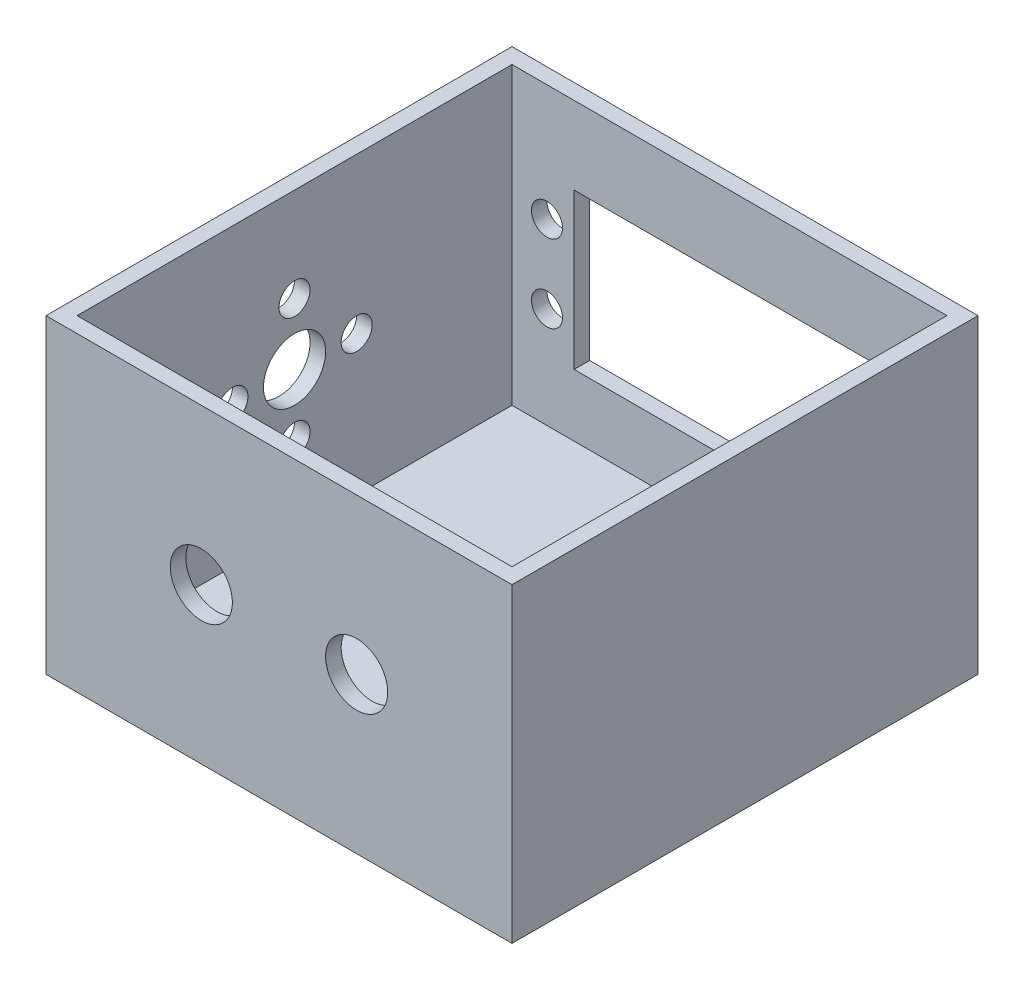
ISO-10303-21;
HEADER;
FILE_DESCRIPTION(('STEP AP214'),'2;1');
FILE_NAME('part.step','',(''),(''),'','','');
FILE_SCHEMA(('AUTOMOTIVE_DESIGN { 1 0 10303 214 1 1 1 1 }'));
ENDSEC;
DATA;
#1=APPLICATION_CONTEXT('core data for automotive mechanical design processes');
#2=APPLICATION_PROTOCOL_DEFINITION('international standard','automotive_design',2000,#1);
#3=PRODUCT_CONTEXT('',#1,'mechanical');
#4=PRODUCT('Part','Part','',(#3));
#5=PRODUCT_RELATED_PRODUCT_CATEGORY('part','',(#4));
#6=PRODUCT_DEFINITION_FORMATION('','',#4);
#7=PRODUCT_DEFINITION_CONTEXT('part definition',#1,'design');
#8=PRODUCT_DEFINITION('design','',#6,#7);
#9=PRODUCT_DEFINITION_SHAPE('','',#8);
#10=(LENGTH_UNIT() NAMED_UNIT(*) SI_UNIT(.MILLI.,.METRE.));
#11=(NAMED_UNIT(*) PLANE_ANGLE_UNIT() SI_UNIT($,.RADIAN.));
#12=(NAMED_UNIT(*) SI_UNIT($,.STERADIAN.) SOLID_ANGLE_UNIT());
#13=UNCERTAINTY_MEASURE_WITH_UNIT(LENGTH_MEASURE(1.E-05),#10,'distance_accuracy_value','');
#14=(GEOMETRIC_REPRESENTATION_CONTEXT(3) GLOBAL_UNCERTAINTY_ASSIGNED_CONTEXT((#13)) GLOBAL_UNIT_ASSIGNED_CONTEXT((#10,
#11,#12)) REPRESENTATION_CONTEXT('',''));
#15=CARTESIAN_POINT('',(0.,0.,0.));
#16=DIRECTION('',(0.,0.,1.));
#17=DIRECTION('',(1.,0.,0.));
#18=AXIS2_PLACEMENT_3D('',#15,#16,#17);
#19=CARTESIAN_POINT('',(0.,40.,60.));
#20=DIRECTION('',(0.,-1.,0.));
#21=DIRECTION('',(1.,0.,0.));
#22=AXIS2_PLACEMENT_3D('',#19,#20,#21);
#23=PLANE('',#22);
#24=DIRECTION('',(-1.,0.,0.));
#25=VECTOR('',#24,1.);
#26=CARTESIAN_POINT('',(0.,40.,0.));
#27=LINE('',#26,#25);
#28=CARTESIAN_POINT('',(60.,40.,0.));
#29=VERTEX_POINT('',#28);
#30=CARTESIAN_POINT('',(0.,40.,0.));
#31=VERTEX_POINT('',#30);
#32=EDGE_CURVE('E191',#29,#31,#27,.T.);
#33=ORIENTED_EDGE('',*,*,#32,.T.);
#34=DIRECTION('',(0.,0.,-1.));
#35=VECTOR('',#34,1.);
#36=CARTESIAN_POINT('',(0.,40.,60.));
#37=LINE('',#36,#35);
#38=CARTESIAN_POINT('',(0.,40.,60.));
#39=VERTEX_POINT('',#38);
#40=EDGE_CURVE('E197',#39,#31,#37,.T.);
#41=ORIENTED_EDGE('',*,*,#40,.F.);
#42=DIRECTION('',(-1.,0.,0.));
#43=VECTOR('',#42,1.);
#44=CARTESIAN_POINT('',(0.,40.,60.));
#45=LINE('',#44,#43);
#46=CARTESIAN_POINT('',(60.,40.,60.));
#47=VERTEX_POINT('',#46);
#48=EDGE_CURVE('E195',#47,#39,#45,.T.);
#49=ORIENTED_EDGE('',*,*,#48,.F.);
#50=DIRECTION('',(0.,0.,-1.));
#51=VECTOR('',#50,1.);
#52=CARTESIAN_POINT('',(60.,40.,60.));
#53=LINE('',#52,#51);
#54=EDGE_CURVE('E207',#47,#29,#53,.T.);
#55=ORIENTED_EDGE('',*,*,#54,.T.);
#56=EDGE_LOOP('',(#33,#41,#49,#55));
#57=FACE_BOUND('',#56,.T.);
#58=DIRECTION('',(-1.,0.,0.));
#59=VECTOR('',#58,1.);
#60=CARTESIAN_POINT('',(0.,40.,2.));
#61=LINE('',#60,#59);
#62=CARTESIAN_POINT('',(58.,40.,2.));
#63=VERTEX_POINT('',#62);
#64=CARTESIAN_POINT('',(2.,40.,2.));
#65=VERTEX_POINT('',#64);
#66=EDGE_CURVE('E167',#63,#65,#61,.T.);
#67=ORIENTED_EDGE('',*,*,#66,.F.);
#68=DIRECTION('',(0.,0.,-1.));
#69=VECTOR('',#68,1.);
#70=CARTESIAN_POINT('',(58.,40.,60.));
#71=LINE('',#70,#69);
#72=CARTESIAN_POINT('',(58.,40.,58.));
#73=VERTEX_POINT('',#72);
#74=EDGE_CURVE('E172',#73,#63,#71,.T.);
#75=ORIENTED_EDGE('',*,*,#74,.F.);
#76=DIRECTION('',(-1.,0.,0.));
#77=VECTOR('',#76,1.);
#78=CARTESIAN_POINT('',(0.,40.,58.));
#79=LINE('',#78,#77);
#80=CARTESIAN_POINT('',(2.,40.,58.));
#81=VERTEX_POINT('',#80);
#82=EDGE_CURVE('E178',#73,#81,#79,.T.);
#83=ORIENTED_EDGE('',*,*,#82,.T.);
#84=DIRECTION('',(0.,0.,-1.));
#85=VECTOR('',#84,1.);
#86=CARTESIAN_POINT('',(2.,40.,60.));
#87=LINE('',#86,#85);
#88=EDGE_CURVE('E179',#81,#65,#87,.T.);
#89=ORIENTED_EDGE('',*,*,#88,.T.);
#90=EDGE_LOOP('',(#67,#75,#83,#89));
#91=FACE_BOUND('',#90,.T.);
#92=ADVANCED_FACE('F35',(#57,#91),#23,.F.);
#93=CARTESIAN_POINT('',(0.,0.,60.));
#94=DIRECTION('',(1.,0.,0.));
#95=DIRECTION('',(0.,0.,-1.));
#96=AXIS2_PLACEMENT_3D('',#93,#94,#95);
#97=PLANE('',#96);
#98=CARTESIAN_POINT('',(0.,12.101681923366,30.));
#99=DIRECTION('',(-1.,0.,0.));
#100=DIRECTION('',(0.,0.,-1.));
#101=AXIS2_PLACEMENT_3D('',#98,#99,#100);
#102=CIRCLE('',#101,1.99999999999999);
#103=CARTESIAN_POINT('',(0.,12.101681923366,28.));
#104=VERTEX_POINT('',#103);
#105=EDGE_CURVE('E359',#104,#104,#102,.T.);
#106=ORIENTED_EDGE('',*,*,#105,.F.);
#107=EDGE_LOOP('',(#106));
#108=FACE_BOUND('',#107,.T.);
#109=CARTESIAN_POINT('',(0.,27.898318076634,30.));
#110=DIRECTION('',(-1.,0.,0.));
#111=DIRECTION('',(0.,0.,1.));
#112=AXIS2_PLACEMENT_3D('',#109,#110,#111);
#113=CIRCLE('',#112,2.);
#114=CARTESIAN_POINT('',(0.,27.898318076634,32.));
#115=VERTEX_POINT('',#114);
#116=EDGE_CURVE('E352',#115,#115,#113,.T.);
#117=ORIENTED_EDGE('',*,*,#116,.F.);
#118=EDGE_LOOP('',(#117));
#119=FACE_BOUND('',#118,.T.);
#120=CARTESIAN_POINT('',(0.,20.,38.));
#121=DIRECTION('',(-1.,0.,0.));
#122=DIRECTION('',(0.,0.,-1.));
#123=AXIS2_PLACEMENT_3D('',#120,#121,#122);
#124=CIRCLE('',#123,2.00000000000001);
#125=CARTESIAN_POINT('',(0.,20.,36.));
#126=VERTEX_POINT('',#125);
#127=EDGE_CURVE('E357',#126,#126,#124,.T.);
#128=ORIENTED_EDGE('',*,*,#127,.F.);
#129=EDGE_LOOP('',(#128));
#130=FACE_BOUND('',#129,.T.);
#131=CARTESIAN_POINT('',(0.,20.,30.));
#132=DIRECTION('',(-1.,0.,0.));
#133=DIRECTION('',(0.,0.,1.));
#134=AXIS2_PLACEMENT_3D('',#131,#132,#133);
#135=CIRCLE('',#134,4.);
#136=CARTESIAN_POINT('',(0.,20.,34.));
#137=VERTEX_POINT('',#136);
#138=EDGE_CURVE('E370',#137,#137,#135,.T.);
#139=ORIENTED_EDGE('',*,*,#138,.F.);
#140=EDGE_LOOP('',(#139));
#141=FACE_BOUND('',#140,.T.);
#142=CARTESIAN_POINT('',(0.,20.,22.));
#143=DIRECTION('',(-1.,0.,0.));
#144=DIRECTION('',(0.,0.,1.));
#145=AXIS2_PLACEMENT_3D('',#142,#143,#144);
#146=CIRCLE('',#145,2.00000000000001);
#147=CARTESIAN_POINT('',(0.,20.,24.));
#148=VERTEX_POINT('',#147);
#149=EDGE_CURVE('E378',#148,#148,#146,.T.);
#150=ORIENTED_EDGE('',*,*,#149,.F.);
#151=EDGE_LOOP('',(#150));
#152=FACE_BOUND('',#151,.T.);
#153=DIRECTION('',(0.,-1.,0.));
#154=VECTOR('',#153,1.);
#155=CARTESIAN_POINT('',(0.,0.,0.));
#156=LINE('',#155,#154);
#157=CARTESIAN_POINT('',(0.,0.,0.));
#158=VERTEX_POINT('',#157);
#159=EDGE_CURVE('E161',#31,#158,#156,.T.);
#160=ORIENTED_EDGE('',*,*,#159,.T.);
#161=DIRECTION('',(0.,0.,-1.));
#162=VECTOR('',#161,1.);
#163=CARTESIAN_POINT('',(0.,0.,60.));
#164=LINE('',#163,#162);
#165=CARTESIAN_POINT('',(0.,0.,60.));
#166=VERTEX_POINT('',#165);
#167=EDGE_CURVE('E11',#166,#158,#164,.T.);
#168=ORIENTED_EDGE('',*,*,#167,.F.);
#169=DIRECTION('',(0.,-1.,0.));
#170=VECTOR('',#169,1.);
#171=CARTESIAN_POINT('',(0.,0.,60.));
#172=LINE('',#171,#170);
#173=EDGE_CURVE('E187',#39,#166,#172,.T.);
#174=ORIENTED_EDGE('',*,*,#173,.F.);
#175=ORIENTED_EDGE('',*,*,#40,.T.);
#176=EDGE_LOOP('',(#160,#168,#174,#175));
#177=FACE_BOUND('',#176,.T.);
#178=ADVANCED_FACE('F37',(#108,#119,#130,#141,#152,#177),#97,.F.);
#179=CARTESIAN_POINT('',(0.,0.,60.));
#180=DIRECTION('',(0.,1.,0.));
#181=DIRECTION('',(0.,0.,1.));
#182=AXIS2_PLACEMENT_3D('',#179,#180,#181);
#183=PLANE('',#182);
#184=CARTESIAN_POINT('',(22.,0.,30.));
#185=DIRECTION('',(0.,-1.,0.));
#186=DIRECTION('',(0.,0.,1.));
#187=AXIS2_PLACEMENT_3D('',#184,#185,#186);
#188=CIRCLE('',#187,2.);
#189=CARTESIAN_POINT('',(22.,0.,32.));
#190=VERTEX_POINT('',#189);
#191=EDGE_CURVE('E401',#190,#190,#188,.T.);
#192=ORIENTED_EDGE('',*,*,#191,.F.);
#193=EDGE_LOOP('',(#192));
#194=FACE_BOUND('',#193,.T.);
#195=CARTESIAN_POINT('',(30.,0.,38.));
#196=DIRECTION('',(0.,-1.,0.));
#197=DIRECTION('',(0.,0.,-1.));
#198=AXIS2_PLACEMENT_3D('',#195,#196,#197);
#199=CIRCLE('',#198,2.00000000000001);
#200=CARTESIAN_POINT('',(30.,0.,36.));
#201=VERTEX_POINT('',#200);
#202=EDGE_CURVE('E394',#201,#201,#199,.T.);
#203=ORIENTED_EDGE('',*,*,#202,.F.);
#204=EDGE_LOOP('',(#203));
#205=FACE_BOUND('',#204,.T.);
#206=CARTESIAN_POINT('',(38.,0.,30.));
#207=DIRECTION('',(0.,-1.,0.));
#208=DIRECTION('',(0.,0.,-1.));
#209=AXIS2_PLACEMENT_3D('',#206,#207,#208);
#210=CIRCLE('',#209,2.);
#211=CARTESIAN_POINT('',(38.,0.,28.));
#212=VERTEX_POINT('',#211);
#213=EDGE_CURVE('E413',#212,#212,#210,.T.);
#214=ORIENTED_EDGE('',*,*,#213,.F.);
#215=EDGE_LOOP('',(#214));
#216=FACE_BOUND('',#215,.T.);
#217=CARTESIAN_POINT('',(30.,0.,22.));
#218=DIRECTION('',(0.,-1.,0.));
#219=DIRECTION('',(0.,0.,1.));
#220=AXIS2_PLACEMENT_3D('',#217,#218,#219);
#221=CIRCLE('',#220,2.00000000000001);
#222=CARTESIAN_POINT('',(30.,0.,24.));
#223=VERTEX_POINT('',#222);
#224=EDGE_CURVE('E406',#223,#223,#221,.T.);
#225=ORIENTED_EDGE('',*,*,#224,.F.);
#226=EDGE_LOOP('',(#225));
#227=FACE_BOUND('',#226,.T.);
#228=CARTESIAN_POINT('',(30.,0.,30.));
#229=DIRECTION('',(0.,-1.,0.));
#230=DIRECTION('',(0.,0.,-1.));
#231=AXIS2_PLACEMENT_3D('',#228,#229,#230);
#232=CIRCLE('',#231,2.);
#233=CARTESIAN_POINT('',(30.,0.,28.));
#234=VERTEX_POINT('',#233);
#235=EDGE_CURVE('E418',#234,#234,#232,.T.);
#236=ORIENTED_EDGE('',*,*,#235,.F.);
#237=EDGE_LOOP('',(#236));
#238=FACE_BOUND('',#237,.T.);
#239=DIRECTION('',(1.,0.,0.));
#240=VECTOR('',#239,1.);
#241=CARTESIAN_POINT('',(0.,0.,0.));
#242=LINE('',#241,#240);
#243=CARTESIAN_POINT('',(60.,0.,0.));
#244=VERTEX_POINT('',#243);
#245=EDGE_CURVE('E200',#158,#244,#242,.T.);
#246=ORIENTED_EDGE('',*,*,#245,.T.);
#247=DIRECTION('',(0.,0.,-1.));
#248=VECTOR('',#247,1.);
#249=CARTESIAN_POINT('',(60.,0.,60.));
#250=LINE('',#249,#248);
#251=CARTESIAN_POINT('',(60.,0.,60.));
#252=VERTEX_POINT('',#251);
#253=EDGE_CURVE('E43',#252,#244,#250,.T.);
#254=ORIENTED_EDGE('',*,*,#253,.F.);
#255=DIRECTION('',(1.,0.,0.));
#256=VECTOR('',#255,1.);
#257=CARTESIAN_POINT('',(0.,0.,60.));
#258=LINE('',#257,#256);
#259=EDGE_CURVE('E190',#166,#252,#258,.T.);
#260=ORIENTED_EDGE('',*,*,#259,.F.);
#261=ORIENTED_EDGE('',*,*,#167,.T.);
#262=EDGE_LOOP('',(#246,#254,#260,#261));
#263=FACE_BOUND('',#262,.T.);
#264=ADVANCED_FACE('F228',(#194,#205,#216,#227,#238,#263),#183,.F.);
#265=CARTESIAN_POINT('',(60.,0.,60.));
#266=DIRECTION('',(-1.,0.,0.));
#267=DIRECTION('',(0.,0.,1.));
#268=AXIS2_PLACEMENT_3D('',#265,#266,#267);
#269=PLANE('',#268);
#270=DIRECTION('',(0.,1.,0.));
#271=VECTOR('',#270,1.);
#272=CARTESIAN_POINT('',(60.,0.,0.));
#273=LINE('',#272,#271);
#274=EDGE_CURVE('E202',#244,#29,#273,.T.);
#275=ORIENTED_EDGE('',*,*,#274,.T.);
#276=ORIENTED_EDGE('',*,*,#54,.F.);
#277=DIRECTION('',(0.,1.,0.));
#278=VECTOR('',#277,1.);
#279=CARTESIAN_POINT('',(60.,0.,60.));
#280=LINE('',#279,#278);
#281=EDGE_CURVE('E193',#252,#47,#280,.T.);
#282=ORIENTED_EDGE('',*,*,#281,.F.);
#283=ORIENTED_EDGE('',*,*,#253,.T.);
#284=EDGE_LOOP('',(#275,#276,#282,#283));
#285=FACE_BOUND('',#284,.T.);
#286=ADVANCED_FACE('F214',(#285),#269,.F.);
#287=CARTESIAN_POINT('',(0.,0.,60.));
#288=DIRECTION('',(0.,0.,-1.));
#289=DIRECTION('',(-1.,0.,0.));
#290=AXIS2_PLACEMENT_3D('',#287,#288,#289);
#291=PLANE('',#290);
#292=CARTESIAN_POINT('',(40.,20.,60.));
#293=DIRECTION('',(0.,0.,-1.));
#294=DIRECTION('',(-1.,0.,0.));
#295=AXIS2_PLACEMENT_3D('',#292,#293,#294);
#296=CIRCLE('',#295,3.99999999999999);
#297=CARTESIAN_POINT('',(36.,20.,60.));
#298=VERTEX_POINT('',#297);
#299=EDGE_CURVE('E384',#298,#298,#296,.T.);
#300=ORIENTED_EDGE('',*,*,#299,.T.);
#301=EDGE_LOOP('',(#300));
#302=FACE_BOUND('',#301,.T.);
#303=CARTESIAN_POINT('',(20.,20.,60.));
#304=DIRECTION('',(0.,0.,1.));
#305=DIRECTION('',(1.,0.,0.));
#306=AXIS2_PLACEMENT_3D('',#303,#304,#305);
#307=CIRCLE('',#306,4.);
#308=CARTESIAN_POINT('',(24.,20.,60.));
#309=VERTEX_POINT('',#308);
#310=EDGE_CURVE('E388',#309,#309,#307,.T.);
#311=ORIENTED_EDGE('',*,*,#310,.F.);
#312=EDGE_LOOP('',(#311));
#313=FACE_BOUND('',#312,.T.);
#314=ORIENTED_EDGE('',*,*,#173,.T.);
#315=ORIENTED_EDGE('',*,*,#259,.T.);
#316=ORIENTED_EDGE('',*,*,#281,.T.);
#317=ORIENTED_EDGE('',*,*,#48,.T.);
#318=EDGE_LOOP('',(#314,#315,#316,#317));
#319=FACE_BOUND('',#318,.T.);
#320=ADVANCED_FACE('F227',(#302,#313,#319),#291,.F.);
#321=CARTESIAN_POINT('',(0.,0.,0.));
#322=DIRECTION('',(0.,0.,-1.));
#323=DIRECTION('',(-1.,0.,0.));
#324=AXIS2_PLACEMENT_3D('',#321,#322,#323);
#325=PLANE('',#324);
#326=CARTESIAN_POINT('',(53.5,25.,0.));
#327=DIRECTION('',(0.,0.,-1.));
#328=DIRECTION('',(-1.,0.,0.));
#329=AXIS2_PLACEMENT_3D('',#326,#327,#328);
#330=CIRCLE('',#329,2.);
#331=CARTESIAN_POINT('',(51.5,25.,0.));
#332=VERTEX_POINT('',#331);
#333=EDGE_CURVE('E424',#332,#332,#330,.T.);
#334=ORIENTED_EDGE('',*,*,#333,.F.);
#335=EDGE_LOOP('',(#334));
#336=FACE_BOUND('',#335,.T.);
#337=CARTESIAN_POINT('',(53.5,15.,0.));
#338=DIRECTION('',(0.,0.,-1.));
#339=DIRECTION('',(1.,0.,0.));
#340=AXIS2_PLACEMENT_3D('',#337,#338,#339);
#341=CIRCLE('',#340,2.);
#342=CARTESIAN_POINT('',(55.5,15.,0.));
#343=VERTEX_POINT('',#342);
#344=EDGE_CURVE('E432',#343,#343,#341,.T.);
#345=ORIENTED_EDGE('',*,*,#344,.F.);
#346=EDGE_LOOP('',(#345));
#347=FACE_BOUND('',#346,.T.);
#348=CARTESIAN_POINT('',(6.5,15.,0.));
#349=DIRECTION('',(0.,0.,-1.));
#350=DIRECTION('',(-1.,0.,0.));
#351=AXIS2_PLACEMENT_3D('',#348,#349,#350);
#352=CIRCLE('',#351,2.);
#353=CARTESIAN_POINT('',(4.5,15.,0.));
#354=VERTEX_POINT('',#353);
#355=EDGE_CURVE('E438',#354,#354,#352,.T.);
#356=ORIENTED_EDGE('',*,*,#355,.F.);
#357=EDGE_LOOP('',(#356));
#358=FACE_BOUND('',#357,.T.);
#359=CARTESIAN_POINT('',(6.5,25.,0.));
#360=DIRECTION('',(0.,0.,-1.));
#361=DIRECTION('',(1.,0.,0.));
#362=AXIS2_PLACEMENT_3D('',#359,#360,#361);
#363=CIRCLE('',#362,2.);
#364=CARTESIAN_POINT('',(8.5,25.,0.));
#365=VERTEX_POINT('',#364);
#366=EDGE_CURVE('E421',#365,#365,#363,.T.);
#367=ORIENTED_EDGE('',*,*,#366,.F.);
#368=EDGE_LOOP('',(#367));
#369=FACE_BOUND('',#368,.T.);
#370=DIRECTION('',(-1.,0.,0.));
#371=VECTOR('',#370,1.);
#372=CARTESIAN_POINT('',(50.,10.,0.));
#373=LINE('',#372,#371);
#374=CARTESIAN_POINT('',(50.,10.,0.));
#375=VERTEX_POINT('',#374);
#376=CARTESIAN_POINT('',(10.,10.,0.));
#377=VERTEX_POINT('',#376);
#378=EDGE_CURVE('E126',#375,#377,#373,.T.);
#379=ORIENTED_EDGE('',*,*,#378,.F.);
#380=DIRECTION('',(0.,-1.,0.));
#381=VECTOR('',#380,1.);
#382=CARTESIAN_POINT('',(50.,30.,0.));
#383=LINE('',#382,#381);
#384=CARTESIAN_POINT('',(50.,30.,0.));
#385=VERTEX_POINT('',#384);
#386=EDGE_CURVE('E134',#385,#375,#383,.T.);
#387=ORIENTED_EDGE('',*,*,#386,.F.);
#388=DIRECTION('',(1.,0.,0.));
#389=VECTOR('',#388,1.);
#390=CARTESIAN_POINT('',(50.,30.,0.));
#391=LINE('',#390,#389);
#392=CARTESIAN_POINT('',(10.,30.,0.));
#393=VERTEX_POINT('',#392);
#394=EDGE_CURVE('E50',#393,#385,#391,.T.);
#395=ORIENTED_EDGE('',*,*,#394,.F.);
#396=DIRECTION('',(0.,1.,0.));
#397=VECTOR('',#396,1.);
#398=CARTESIAN_POINT('',(10.,30.,0.));
#399=LINE('',#398,#397);
#400=EDGE_CURVE('E143',#377,#393,#399,.T.);
#401=ORIENTED_EDGE('',*,*,#400,.F.);
#402=EDGE_LOOP('',(#379,#387,#395,#401));
#403=FACE_BOUND('',#402,.T.);
#404=ORIENTED_EDGE('',*,*,#159,.F.);
#405=ORIENTED_EDGE('',*,*,#32,.F.);
#406=ORIENTED_EDGE('',*,*,#274,.F.);
#407=ORIENTED_EDGE('',*,*,#245,.F.);
#408=EDGE_LOOP('',(#404,#405,#406,#407));
#409=FACE_BOUND('',#408,.T.);
#410=ADVANCED_FACE('F140',(#336,#347,#358,#369,#403,#409),#325,.T.);
#411=CARTESIAN_POINT('',(2.,0.,60.));
#412=DIRECTION('',(1.,0.,0.));
#413=DIRECTION('',(0.,0.,-1.));
#414=AXIS2_PLACEMENT_3D('',#411,#412,#413);
#415=PLANE('',#414);
#416=CARTESIAN_POINT('',(2.,12.101681923366,30.));
#417=DIRECTION('',(1.,0.,0.));
#418=DIRECTION('',(0.,0.,-1.));
#419=AXIS2_PLACEMENT_3D('',#416,#417,#418);
#420=CIRCLE('',#419,1.99999999999999);
#421=CARTESIAN_POINT('',(2.,12.101681923366,28.));
#422=VERTEX_POINT('',#421);
#423=EDGE_CURVE('E362',#422,#422,#420,.F.);
#424=ORIENTED_EDGE('',*,*,#423,.T.);
#425=EDGE_LOOP('',(#424));
#426=FACE_BOUND('',#425,.T.);
#427=CARTESIAN_POINT('',(2.,27.898318076634,30.));
#428=DIRECTION('',(1.,0.,0.));
#429=DIRECTION('',(0.,0.,-1.));
#430=AXIS2_PLACEMENT_3D('',#427,#428,#429);
#431=CIRCLE('',#430,2.);
#432=CARTESIAN_POINT('',(2.,27.898318076634,28.));
#433=VERTEX_POINT('',#432);
#434=EDGE_CURVE('E349',#433,#433,#431,.F.);
#435=ORIENTED_EDGE('',*,*,#434,.T.);
#436=EDGE_LOOP('',(#435));
#437=FACE_BOUND('',#436,.T.);
#438=CARTESIAN_POINT('',(2.,20.,38.));
#439=DIRECTION('',(1.,0.,0.));
#440=DIRECTION('',(0.,0.,-1.));
#441=AXIS2_PLACEMENT_3D('',#438,#439,#440);
#442=CIRCLE('',#441,2.00000000000001);
#443=CARTESIAN_POINT('',(2.,20.,36.));
#444=VERTEX_POINT('',#443);
#445=EDGE_CURVE('E354',#444,#444,#442,.F.);
#446=ORIENTED_EDGE('',*,*,#445,.T.);
#447=EDGE_LOOP('',(#446));
#448=FACE_BOUND('',#447,.T.);
#449=CARTESIAN_POINT('',(2.,20.,30.));
#450=DIRECTION('',(1.,0.,0.));
#451=DIRECTION('',(0.,0.,-1.));
#452=AXIS2_PLACEMENT_3D('',#449,#450,#451);
#453=CIRCLE('',#452,4.);
#454=CARTESIAN_POINT('',(2.,20.,26.));
#455=VERTEX_POINT('',#454);
#456=EDGE_CURVE('E367',#455,#455,#453,.F.);
#457=ORIENTED_EDGE('',*,*,#456,.T.);
#458=EDGE_LOOP('',(#457));
#459=FACE_BOUND('',#458,.T.);
#460=CARTESIAN_POINT('',(2.,20.,22.));
#461=DIRECTION('',(1.,0.,0.));
#462=DIRECTION('',(0.,0.,-1.));
#463=AXIS2_PLACEMENT_3D('',#460,#461,#462);
#464=CIRCLE('',#463,2.00000000000001);
#465=CARTESIAN_POINT('',(2.,20.,20.));
#466=VERTEX_POINT('',#465);
#467=EDGE_CURVE('E372',#466,#466,#464,.F.);
#468=ORIENTED_EDGE('',*,*,#467,.T.);
#469=EDGE_LOOP('',(#468));
#470=FACE_BOUND('',#469,.T.);
#471=DIRECTION('',(0.,-1.,0.));
#472=VECTOR('',#471,1.);
#473=CARTESIAN_POINT('',(2.,0.,2.));
#474=LINE('',#473,#472);
#475=CARTESIAN_POINT('',(2.,2.,2.));
#476=VERTEX_POINT('',#475);
#477=EDGE_CURVE('E154',#65,#476,#474,.T.);
#478=ORIENTED_EDGE('',*,*,#477,.F.);
#479=ORIENTED_EDGE('',*,*,#88,.F.);
#480=DIRECTION('',(0.,-1.,0.));
#481=VECTOR('',#480,1.);
#482=CARTESIAN_POINT('',(2.,0.,58.));
#483=LINE('',#482,#481);
#484=CARTESIAN_POINT('',(2.,2.,58.));
#485=VERTEX_POINT('',#484);
#486=EDGE_CURVE('E163',#81,#485,#483,.T.);
#487=ORIENTED_EDGE('',*,*,#486,.T.);
#488=DIRECTION('',(0.,0.,-1.));
#489=VECTOR('',#488,1.);
#490=CARTESIAN_POINT('',(2.,2.,60.));
#491=LINE('',#490,#489);
#492=EDGE_CURVE('E158',#485,#476,#491,.T.);
#493=ORIENTED_EDGE('',*,*,#492,.T.);
#494=EDGE_LOOP('',(#478,#479,#487,#493));
#495=FACE_BOUND('',#494,.T.);
#496=ADVANCED_FACE('F246',(#426,#437,#448,#459,#470,#495),#415,.T.);
#497=CARTESIAN_POINT('',(0.,2.,60.));
#498=DIRECTION('',(0.,1.,0.));
#499=DIRECTION('',(0.,0.,1.));
#500=AXIS2_PLACEMENT_3D('',#497,#498,#499);
#501=PLANE('',#500);
#502=CARTESIAN_POINT('',(22.,2.,30.));
#503=DIRECTION('',(0.,1.,0.));
#504=DIRECTION('',(0.,0.,1.));
#505=AXIS2_PLACEMENT_3D('',#502,#503,#504);
#506=CIRCLE('',#505,2.);
#507=CARTESIAN_POINT('',(22.,2.,32.));
#508=VERTEX_POINT('',#507);
#509=EDGE_CURVE('E391',#508,#508,#506,.F.);
#510=ORIENTED_EDGE('',*,*,#509,.T.);
#511=EDGE_LOOP('',(#510));
#512=FACE_BOUND('',#511,.T.);
#513=CARTESIAN_POINT('',(30.,2.,38.));
#514=DIRECTION('',(0.,1.,0.));
#515=DIRECTION('',(0.,0.,1.));
#516=AXIS2_PLACEMENT_3D('',#513,#514,#515);
#517=CIRCLE('',#516,2.00000000000001);
#518=CARTESIAN_POINT('',(30.,2.,40.));
#519=VERTEX_POINT('',#518);
#520=EDGE_CURVE('E398',#519,#519,#517,.F.);
#521=ORIENTED_EDGE('',*,*,#520,.T.);
#522=EDGE_LOOP('',(#521));
#523=FACE_BOUND('',#522,.T.);
#524=CARTESIAN_POINT('',(38.,2.,30.));
#525=DIRECTION('',(0.,1.,0.));
#526=DIRECTION('',(0.,0.,1.));
#527=AXIS2_PLACEMENT_3D('',#524,#525,#526);
#528=CIRCLE('',#527,2.);
#529=CARTESIAN_POINT('',(38.,2.,32.));
#530=VERTEX_POINT('',#529);
#531=EDGE_CURVE('E397',#530,#530,#528,.F.);
#532=ORIENTED_EDGE('',*,*,#531,.T.);
#533=EDGE_LOOP('',(#532));
#534=FACE_BOUND('',#533,.T.);
#535=CARTESIAN_POINT('',(30.,2.,22.));
#536=DIRECTION('',(0.,1.,0.));
#537=DIRECTION('',(0.,0.,1.));
#538=AXIS2_PLACEMENT_3D('',#535,#536,#537);
#539=CIRCLE('',#538,2.00000000000001);
#540=CARTESIAN_POINT('',(30.,2.,24.));
#541=VERTEX_POINT('',#540);
#542=EDGE_CURVE('E410',#541,#541,#539,.F.);
#543=ORIENTED_EDGE('',*,*,#542,.T.);
#544=EDGE_LOOP('',(#543));
#545=FACE_BOUND('',#544,.T.);
#546=CARTESIAN_POINT('',(30.,2.,30.));
#547=DIRECTION('',(0.,1.,0.));
#548=DIRECTION('',(0.,0.,1.));
#549=AXIS2_PLACEMENT_3D('',#546,#547,#548);
#550=CIRCLE('',#549,2.);
#551=CARTESIAN_POINT('',(30.,2.,32.));
#552=VERTEX_POINT('',#551);
#553=EDGE_CURVE('E409',#552,#552,#550,.F.);
#554=ORIENTED_EDGE('',*,*,#553,.T.);
#555=EDGE_LOOP('',(#554));
#556=FACE_BOUND('',#555,.T.);
#557=DIRECTION('',(1.,0.,0.));
#558=VECTOR('',#557,1.);
#559=CARTESIAN_POINT('',(0.,2.,2.));
#560=LINE('',#559,#558);
#561=CARTESIAN_POINT('',(58.,2.,2.));
#562=VERTEX_POINT('',#561);
#563=EDGE_CURVE('E157',#476,#562,#560,.T.);
#564=ORIENTED_EDGE('',*,*,#563,.F.);
#565=ORIENTED_EDGE('',*,*,#492,.F.);
#566=DIRECTION('',(1.,0.,0.));
#567=VECTOR('',#566,1.);
#568=CARTESIAN_POINT('',(0.,2.,58.));
#569=LINE('',#568,#567);
#570=CARTESIAN_POINT('',(58.,2.,58.));
#571=VERTEX_POINT('',#570);
#572=EDGE_CURVE('E166',#485,#571,#569,.T.);
#573=ORIENTED_EDGE('',*,*,#572,.T.);
#574=DIRECTION('',(0.,0.,-1.));
#575=VECTOR('',#574,1.);
#576=CARTESIAN_POINT('',(58.,2.,60.));
#577=LINE('',#576,#575);
#578=EDGE_CURVE('E162',#571,#562,#577,.T.);
#579=ORIENTED_EDGE('',*,*,#578,.T.);
#580=EDGE_LOOP('',(#564,#565,#573,#579));
#581=FACE_BOUND('',#580,.T.);
#582=ADVANCED_FACE('F262',(#512,#523,#534,#545,#556,#581),#501,.T.);
#583=CARTESIAN_POINT('',(58.,0.,60.));
#584=DIRECTION('',(-1.,0.,0.));
#585=DIRECTION('',(0.,0.,1.));
#586=AXIS2_PLACEMENT_3D('',#583,#584,#585);
#587=PLANE('',#586);
#588=DIRECTION('',(0.,1.,0.));
#589=VECTOR('',#588,1.);
#590=CARTESIAN_POINT('',(58.,0.,2.));
#591=LINE('',#590,#589);
#592=EDGE_CURVE('E169',#562,#63,#591,.T.);
#593=ORIENTED_EDGE('',*,*,#592,.F.);
#594=ORIENTED_EDGE('',*,*,#578,.F.);
#595=DIRECTION('',(0.,1.,0.));
#596=VECTOR('',#595,1.);
#597=CARTESIAN_POINT('',(58.,0.,58.));
#598=LINE('',#597,#596);
#599=EDGE_CURVE('E174',#571,#73,#598,.T.);
#600=ORIENTED_EDGE('',*,*,#599,.T.);
#601=ORIENTED_EDGE('',*,*,#74,.T.);
#602=EDGE_LOOP('',(#593,#594,#600,#601));
#603=FACE_BOUND('',#602,.T.);
#604=ADVANCED_FACE('F258',(#603),#587,.T.);
#605=CARTESIAN_POINT('',(0.,0.,58.));
#606=DIRECTION('',(0.,0.,-1.));
#607=DIRECTION('',(-1.,0.,0.));
#608=AXIS2_PLACEMENT_3D('',#605,#606,#607);
#609=PLANE('',#608);
#610=CARTESIAN_POINT('',(40.,20.,58.));
#611=DIRECTION('',(0.,0.,-1.));
#612=DIRECTION('',(-1.,0.,0.));
#613=AXIS2_PLACEMENT_3D('',#610,#611,#612);
#614=CIRCLE('',#613,3.99999999999999);
#615=CARTESIAN_POINT('',(36.,20.,58.));
#616=VERTEX_POINT('',#615);
#617=EDGE_CURVE('E381',#616,#616,#614,.T.);
#618=ORIENTED_EDGE('',*,*,#617,.F.);
#619=EDGE_LOOP('',(#618));
#620=FACE_BOUND('',#619,.T.);
#621=CARTESIAN_POINT('',(20.,20.,58.));
#622=DIRECTION('',(0.,0.,-1.));
#623=DIRECTION('',(-1.,0.,0.));
#624=AXIS2_PLACEMENT_3D('',#621,#622,#623);
#625=CIRCLE('',#624,4.);
#626=CARTESIAN_POINT('',(16.,20.,58.));
#627=VERTEX_POINT('',#626);
#628=EDGE_CURVE('E387',#627,#627,#625,.F.);
#629=ORIENTED_EDGE('',*,*,#628,.T.);
#630=EDGE_LOOP('',(#629));
#631=FACE_BOUND('',#630,.T.);
#632=ORIENTED_EDGE('',*,*,#486,.F.);
#633=ORIENTED_EDGE('',*,*,#82,.F.);
#634=ORIENTED_EDGE('',*,*,#599,.F.);
#635=ORIENTED_EDGE('',*,*,#572,.F.);
#636=EDGE_LOOP('',(#632,#633,#634,#635));
#637=FACE_BOUND('',#636,.T.);
#638=ADVANCED_FACE('F254',(#620,#631,#637),#609,.T.);
#639=CARTESIAN_POINT('',(0.,0.,2.));
#640=DIRECTION('',(0.,0.,-1.));
#641=DIRECTION('',(-1.,0.,0.));
#642=AXIS2_PLACEMENT_3D('',#639,#640,#641);
#643=PLANE('',#642);
#644=CARTESIAN_POINT('',(53.5,25.,2.));
#645=DIRECTION('',(0.,0.,-1.));
#646=DIRECTION('',(-1.,0.,0.));
#647=AXIS2_PLACEMENT_3D('',#644,#645,#646);
#648=CIRCLE('',#647,2.);
#649=CARTESIAN_POINT('',(51.5,25.,2.));
#650=VERTEX_POINT('',#649);
#651=EDGE_CURVE('E427',#650,#650,#648,.F.);
#652=ORIENTED_EDGE('',*,*,#651,.F.);
#653=EDGE_LOOP('',(#652));
#654=FACE_BOUND('',#653,.T.);
#655=CARTESIAN_POINT('',(53.5,15.,2.));
#656=DIRECTION('',(0.,0.,-1.));
#657=DIRECTION('',(-1.,0.,0.));
#658=AXIS2_PLACEMENT_3D('',#655,#656,#657);
#659=CIRCLE('',#658,2.);
#660=CARTESIAN_POINT('',(51.5,15.,2.));
#661=VERTEX_POINT('',#660);
#662=EDGE_CURVE('E428',#661,#661,#659,.F.);
#663=ORIENTED_EDGE('',*,*,#662,.F.);
#664=EDGE_LOOP('',(#663));
#665=FACE_BOUND('',#664,.T.);
#666=CARTESIAN_POINT('',(6.5,15.,2.));
#667=DIRECTION('',(0.,0.,-1.));
#668=DIRECTION('',(-1.,0.,0.));
#669=AXIS2_PLACEMENT_3D('',#666,#667,#668);
#670=CIRCLE('',#669,2.);
#671=CARTESIAN_POINT('',(4.5,15.,2.));
#672=VERTEX_POINT('',#671);
#673=EDGE_CURVE('E435',#672,#672,#670,.F.);
#674=ORIENTED_EDGE('',*,*,#673,.F.);
#675=EDGE_LOOP('',(#674));
#676=FACE_BOUND('',#675,.T.);
#677=CARTESIAN_POINT('',(6.5,25.,2.));
#678=DIRECTION('',(0.,0.,-1.));
#679=DIRECTION('',(-1.,0.,0.));
#680=AXIS2_PLACEMENT_3D('',#677,#678,#679);
#681=CIRCLE('',#680,2.);
#682=CARTESIAN_POINT('',(4.5,25.,2.));
#683=VERTEX_POINT('',#682);
#684=EDGE_CURVE('E441',#683,#683,#681,.F.);
#685=ORIENTED_EDGE('',*,*,#684,.F.);
#686=EDGE_LOOP('',(#685));
#687=FACE_BOUND('',#686,.T.);
#688=DIRECTION('',(0.,1.,0.));
#689=VECTOR('',#688,1.);
#690=CARTESIAN_POINT('',(50.,30.,2.));
#691=LINE('',#690,#689);
#692=CARTESIAN_POINT('',(50.,10.,2.));
#693=VERTEX_POINT('',#692);
#694=CARTESIAN_POINT('',(50.,30.,2.));
#695=VERTEX_POINT('',#694);
#696=EDGE_CURVE('E138',#693,#695,#691,.T.);
#697=ORIENTED_EDGE('',*,*,#696,.F.);
#698=DIRECTION('',(1.,0.,0.));
#699=VECTOR('',#698,1.);
#700=CARTESIAN_POINT('',(50.,10.,2.));
#701=LINE('',#700,#699);
#702=CARTESIAN_POINT('',(10.,10.,2.));
#703=VERTEX_POINT('',#702);
#704=EDGE_CURVE('E58',#703,#693,#701,.T.);
#705=ORIENTED_EDGE('',*,*,#704,.F.);
#706=DIRECTION('',(0.,-1.,0.));
#707=VECTOR('',#706,1.);
#708=CARTESIAN_POINT('',(10.,30.,2.));
#709=LINE('',#708,#707);
#710=CARTESIAN_POINT('',(10.,30.,2.));
#711=VERTEX_POINT('',#710);
#712=EDGE_CURVE('E431',#711,#703,#709,.T.);
#713=ORIENTED_EDGE('',*,*,#712,.F.);
#714=DIRECTION('',(-1.,0.,0.));
#715=VECTOR('',#714,1.);
#716=CARTESIAN_POINT('',(50.,30.,2.));
#717=LINE('',#716,#715);
#718=EDGE_CURVE('E450',#695,#711,#717,.T.);
#719=ORIENTED_EDGE('',*,*,#718,.F.);
#720=EDGE_LOOP('',(#697,#705,#713,#719));
#721=FACE_BOUND('',#720,.T.);
#722=ORIENTED_EDGE('',*,*,#477,.T.);
#723=ORIENTED_EDGE('',*,*,#563,.T.);
#724=ORIENTED_EDGE('',*,*,#592,.T.);
#725=ORIENTED_EDGE('',*,*,#66,.T.);
#726=EDGE_LOOP('',(#722,#723,#724,#725));
#727=FACE_BOUND('',#726,.T.);
#728=ADVANCED_FACE('F251',(#654,#665,#676,#687,#721,#727),#643,.F.);
#729=CARTESIAN_POINT('',(50.,10.,60.001));
#730=DIRECTION('',(0.,-1.,0.));
#731=DIRECTION('',(1.,0.,0.));
#732=AXIS2_PLACEMENT_3D('',#729,#730,#731);
#733=PLANE('',#732);
#734=ORIENTED_EDGE('',*,*,#704,.T.);
#735=DIRECTION('',(0.,0.,-1.));
#736=VECTOR('',#735,1.);
#737=CARTESIAN_POINT('',(50.,10.,60.001));
#738=LINE('',#737,#736);
#739=EDGE_CURVE('E122',#693,#375,#738,.T.);
#740=ORIENTED_EDGE('',*,*,#739,.T.);
#741=ORIENTED_EDGE('',*,*,#378,.T.);
#742=DIRECTION('',(0.,0.,-1.));
#743=VECTOR('',#742,1.);
#744=CARTESIAN_POINT('',(10.,10.,60.001));
#745=LINE('',#744,#743);
#746=EDGE_CURVE('E131',#703,#377,#745,.T.);
#747=ORIENTED_EDGE('',*,*,#746,.F.);
#748=EDGE_LOOP('',(#734,#740,#741,#747));
#749=FACE_BOUND('',#748,.T.);
#750=ADVANCED_FACE('F124',(#749),#733,.F.);
#751=CARTESIAN_POINT('',(10.,30.,60.001));
#752=DIRECTION('',(-1.,0.,0.));
#753=DIRECTION('',(0.,-1.,0.));
#754=AXIS2_PLACEMENT_3D('',#751,#752,#753);
#755=PLANE('',#754);
#756=ORIENTED_EDGE('',*,*,#712,.T.);
#757=ORIENTED_EDGE('',*,*,#746,.T.);
#758=ORIENTED_EDGE('',*,*,#400,.T.);
#759=DIRECTION('',(0.,0.,-1.));
#760=VECTOR('',#759,1.);
#761=CARTESIAN_POINT('',(10.,30.,60.001));
#762=LINE('',#761,#760);
#763=EDGE_CURVE('E150',#711,#393,#762,.T.);
#764=ORIENTED_EDGE('',*,*,#763,.F.);
#765=EDGE_LOOP('',(#756,#757,#758,#764));
#766=FACE_BOUND('',#765,.T.);
#767=ADVANCED_FACE('F276',(#766),#755,.F.);
#768=CARTESIAN_POINT('',(50.,30.,60.001));
#769=DIRECTION('',(0.,1.,0.));
#770=DIRECTION('',(0.,0.,1.));
#771=AXIS2_PLACEMENT_3D('',#768,#769,#770);
#772=PLANE('',#771);
#773=ORIENTED_EDGE('',*,*,#718,.T.);
#774=ORIENTED_EDGE('',*,*,#763,.T.);
#775=ORIENTED_EDGE('',*,*,#394,.T.);
#776=DIRECTION('',(0.,0.,-1.));
#777=VECTOR('',#776,1.);
#778=CARTESIAN_POINT('',(50.,30.,60.001));
#779=LINE('',#778,#777);
#780=EDGE_CURVE('E136',#695,#385,#779,.T.);
#781=ORIENTED_EDGE('',*,*,#780,.F.);
#782=EDGE_LOOP('',(#773,#774,#775,#781));
#783=FACE_BOUND('',#782,.T.);
#784=ADVANCED_FACE('F273',(#783),#772,.F.);
#785=CARTESIAN_POINT('',(50.,30.,60.001));
#786=DIRECTION('',(1.,0.,0.));
#787=DIRECTION('',(0.,1.,0.));
#788=AXIS2_PLACEMENT_3D('',#785,#786,#787);
#789=PLANE('',#788);
#790=ORIENTED_EDGE('',*,*,#696,.T.);
#791=ORIENTED_EDGE('',*,*,#780,.T.);
#792=ORIENTED_EDGE('',*,*,#386,.T.);
#793=ORIENTED_EDGE('',*,*,#739,.F.);
#794=EDGE_LOOP('',(#790,#791,#792,#793));
#795=FACE_BOUND('',#794,.T.);
#796=ADVANCED_FACE('F135',(#795),#789,.F.);
#797=CARTESIAN_POINT('',(6.5,25.,60.001));
#798=DIRECTION('',(0.,0.,-1.));
#799=DIRECTION('',(-1.,0.,0.));
#800=AXIS2_PLACEMENT_3D('',#797,#798,#799);
#801=CYLINDRICAL_SURFACE('',#800,2.);
#802=ORIENTED_EDGE('',*,*,#366,.T.);
#803=EDGE_LOOP('',(#802));
#804=FACE_BOUND('',#803,.T.);
#805=ORIENTED_EDGE('',*,*,#684,.T.);
#806=EDGE_LOOP('',(#805));
#807=FACE_BOUND('',#806,.T.);
#808=ADVANCED_FACE('F272',(#804,#807),#801,.F.);
#809=CARTESIAN_POINT('',(6.5,15.,60.001));
#810=DIRECTION('',(0.,0.,-1.));
#811=DIRECTION('',(-1.,0.,0.));
#812=AXIS2_PLACEMENT_3D('',#809,#810,#811);
#813=CYLINDRICAL_SURFACE('',#812,2.);
#814=ORIENTED_EDGE('',*,*,#355,.T.);
#815=EDGE_LOOP('',(#814));
#816=FACE_BOUND('',#815,.T.);
#817=ORIENTED_EDGE('',*,*,#673,.T.);
#818=EDGE_LOOP('',(#817));
#819=FACE_BOUND('',#818,.T.);
#820=ADVANCED_FACE('F284',(#816,#819),#813,.F.);
#821=CARTESIAN_POINT('',(53.5,15.,60.001));
#822=DIRECTION('',(0.,0.,-1.));
#823=DIRECTION('',(-1.,0.,0.));
#824=AXIS2_PLACEMENT_3D('',#821,#822,#823);
#825=CYLINDRICAL_SURFACE('',#824,2.);
#826=ORIENTED_EDGE('',*,*,#344,.T.);
#827=EDGE_LOOP('',(#826));
#828=FACE_BOUND('',#827,.T.);
#829=ORIENTED_EDGE('',*,*,#662,.T.);
#830=EDGE_LOOP('',(#829));
#831=FACE_BOUND('',#830,.T.);
#832=ADVANCED_FACE('F288',(#828,#831),#825,.F.);
#833=CARTESIAN_POINT('',(53.5,25.,60.001));
#834=DIRECTION('',(0.,0.,-1.));
#835=DIRECTION('',(-1.,0.,0.));
#836=AXIS2_PLACEMENT_3D('',#833,#834,#835);
#837=CYLINDRICAL_SURFACE('',#836,2.);
#838=ORIENTED_EDGE('',*,*,#333,.T.);
#839=EDGE_LOOP('',(#838));
#840=FACE_BOUND('',#839,.T.);
#841=ORIENTED_EDGE('',*,*,#651,.T.);
#842=EDGE_LOOP('',(#841));
#843=FACE_BOUND('',#842,.T.);
#844=ADVANCED_FACE('F292',(#840,#843),#837,.F.);
#845=CARTESIAN_POINT('',(30.,40.001,30.));
#846=DIRECTION('',(0.,-1.,0.));
#847=DIRECTION('',(0.,0.,-1.));
#848=AXIS2_PLACEMENT_3D('',#845,#846,#847);
#849=CYLINDRICAL_SURFACE('',#848,2.);
#850=ORIENTED_EDGE('',*,*,#553,.F.);
#851=EDGE_LOOP('',(#850));
#852=FACE_BOUND('',#851,.T.);
#853=ORIENTED_EDGE('',*,*,#235,.T.);
#854=EDGE_LOOP('',(#853));
#855=FACE_BOUND('',#854,.T.);
#856=ADVANCED_FACE('F296',(#852,#855),#849,.F.);
#857=CARTESIAN_POINT('',(30.,40.001,22.));
#858=DIRECTION('',(0.,-1.,0.));
#859=DIRECTION('',(0.,0.,-1.));
#860=AXIS2_PLACEMENT_3D('',#857,#858,#859);
#861=CYLINDRICAL_SURFACE('',#860,2.00000000000001);
#862=ORIENTED_EDGE('',*,*,#542,.F.);
#863=EDGE_LOOP('',(#862));
#864=FACE_BOUND('',#863,.T.);
#865=ORIENTED_EDGE('',*,*,#224,.T.);
#866=EDGE_LOOP('',(#865));
#867=FACE_BOUND('',#866,.T.);
#868=ADVANCED_FACE('F300',(#864,#867),#861,.F.);
#869=CARTESIAN_POINT('',(38.,40.001,30.));
#870=DIRECTION('',(0.,-1.,0.));
#871=DIRECTION('',(0.,0.,-1.));
#872=AXIS2_PLACEMENT_3D('',#869,#870,#871);
#873=CYLINDRICAL_SURFACE('',#872,2.);
#874=ORIENTED_EDGE('',*,*,#531,.F.);
#875=EDGE_LOOP('',(#874));
#876=FACE_BOUND('',#875,.T.);
#877=ORIENTED_EDGE('',*,*,#213,.T.);
#878=EDGE_LOOP('',(#877));
#879=FACE_BOUND('',#878,.T.);
#880=ADVANCED_FACE('F302',(#876,#879),#873,.F.);
#881=CARTESIAN_POINT('',(30.,40.001,38.));
#882=DIRECTION('',(0.,-1.,0.));
#883=DIRECTION('',(0.,0.,-1.));
#884=AXIS2_PLACEMENT_3D('',#881,#882,#883);
#885=CYLINDRICAL_SURFACE('',#884,2.00000000000001);
#886=ORIENTED_EDGE('',*,*,#520,.F.);
#887=EDGE_LOOP('',(#886));
#888=FACE_BOUND('',#887,.T.);
#889=ORIENTED_EDGE('',*,*,#202,.T.);
#890=EDGE_LOOP('',(#889));
#891=FACE_BOUND('',#890,.T.);
#892=ADVANCED_FACE('F305',(#888,#891),#885,.F.);
#893=CARTESIAN_POINT('',(22.,40.001,30.));
#894=DIRECTION('',(0.,-1.,0.));
#895=DIRECTION('',(0.,0.,-1.));
#896=AXIS2_PLACEMENT_3D('',#893,#894,#895);
#897=CYLINDRICAL_SURFACE('',#896,2.);
#898=ORIENTED_EDGE('',*,*,#509,.F.);
#899=EDGE_LOOP('',(#898));
#900=FACE_BOUND('',#899,.T.);
#901=ORIENTED_EDGE('',*,*,#191,.T.);
#902=EDGE_LOOP('',(#901));
#903=FACE_BOUND('',#902,.T.);
#904=ADVANCED_FACE('F310',(#900,#903),#897,.F.);
#905=CARTESIAN_POINT('',(20.,20.,-0.001000000000001));
#906=DIRECTION('',(0.,0.,1.));
#907=DIRECTION('',(1.,0.,0.));
#908=AXIS2_PLACEMENT_3D('',#905,#906,#907);
#909=CYLINDRICAL_SURFACE('',#908,4.);
#910=ORIENTED_EDGE('',*,*,#628,.F.);
#911=EDGE_LOOP('',(#910));
#912=FACE_BOUND('',#911,.T.);
#913=ORIENTED_EDGE('',*,*,#310,.T.);
#914=EDGE_LOOP('',(#913));
#915=FACE_BOUND('',#914,.T.);
#916=ADVANCED_FACE('F313',(#912,#915),#909,.F.);
#917=CARTESIAN_POINT('',(40.,20.,-0.001000000000001));
#918=DIRECTION('',(0.,0.,1.));
#919=DIRECTION('',(1.,0.,0.));
#920=AXIS2_PLACEMENT_3D('',#917,#918,#919);
#921=CYLINDRICAL_SURFACE('',#920,3.99999999999999);
#922=ORIENTED_EDGE('',*,*,#617,.T.);
#923=EDGE_LOOP('',(#922));
#924=FACE_BOUND('',#923,.T.);
#925=ORIENTED_EDGE('',*,*,#299,.F.);
#926=EDGE_LOOP('',(#925));
#927=FACE_BOUND('',#926,.T.);
#928=ADVANCED_FACE('F320',(#924,#927),#921,.F.);
#929=CARTESIAN_POINT('',(60.001,20.,22.));
#930=DIRECTION('',(-1.,0.,0.));
#931=DIRECTION('',(0.,0.,1.));
#932=AXIS2_PLACEMENT_3D('',#929,#930,#931);
#933=CYLINDRICAL_SURFACE('',#932,2.00000000000001);
#934=ORIENTED_EDGE('',*,*,#467,.F.);
#935=EDGE_LOOP('',(#934));
#936=FACE_BOUND('',#935,.T.);
#937=ORIENTED_EDGE('',*,*,#149,.T.);
#938=EDGE_LOOP('',(#937));
#939=FACE_BOUND('',#938,.T.);
#940=ADVANCED_FACE('F324',(#936,#939),#933,.F.);
#941=CARTESIAN_POINT('',(60.001,20.,30.));
#942=DIRECTION('',(-1.,0.,0.));
#943=DIRECTION('',(0.,0.,1.));
#944=AXIS2_PLACEMENT_3D('',#941,#942,#943);
#945=CYLINDRICAL_SURFACE('',#944,4.);
#946=ORIENTED_EDGE('',*,*,#456,.F.);
#947=EDGE_LOOP('',(#946));
#948=FACE_BOUND('',#947,.T.);
#949=ORIENTED_EDGE('',*,*,#138,.T.);
#950=EDGE_LOOP('',(#949));
#951=FACE_BOUND('',#950,.T.);
#952=ADVANCED_FACE('F328',(#948,#951),#945,.F.);
#953=CARTESIAN_POINT('',(60.001,20.,38.));
#954=DIRECTION('',(-1.,0.,0.));
#955=DIRECTION('',(0.,0.,1.));
#956=AXIS2_PLACEMENT_3D('',#953,#954,#955);
#957=CYLINDRICAL_SURFACE('',#956,2.00000000000001);
#958=ORIENTED_EDGE('',*,*,#445,.F.);
#959=EDGE_LOOP('',(#958));
#960=FACE_BOUND('',#959,.T.);
#961=ORIENTED_EDGE('',*,*,#127,.T.);
#962=EDGE_LOOP('',(#961));
#963=FACE_BOUND('',#962,.T.);
#964=ADVANCED_FACE('F330',(#960,#963),#957,.F.);
#965=CARTESIAN_POINT('',(60.001,27.898318076634,30.));
#966=DIRECTION('',(-1.,0.,0.));
#967=DIRECTION('',(0.,0.,1.));
#968=AXIS2_PLACEMENT_3D('',#965,#966,#967);
#969=CYLINDRICAL_SURFACE('',#968,2.);
#970=ORIENTED_EDGE('',*,*,#434,.F.);
#971=EDGE_LOOP('',(#970));
#972=FACE_BOUND('',#971,.T.);
#973=ORIENTED_EDGE('',*,*,#116,.T.);
#974=EDGE_LOOP('',(#973));
#975=FACE_BOUND('',#974,.T.);
#976=ADVANCED_FACE('F333',(#972,#975),#969,.F.);
#977=CARTESIAN_POINT('',(60.001,12.101681923366,30.));
#978=DIRECTION('',(-1.,0.,0.));
#979=DIRECTION('',(0.,0.,1.));
#980=AXIS2_PLACEMENT_3D('',#977,#978,#979);
#981=CYLINDRICAL_SURFACE('',#980,1.99999999999999);
#982=ORIENTED_EDGE('',*,*,#423,.F.);
#983=EDGE_LOOP('',(#982));
#984=FACE_BOUND('',#983,.T.);
#985=ORIENTED_EDGE('',*,*,#105,.T.);
#986=EDGE_LOOP('',(#985));
#987=FACE_BOUND('',#986,.T.);
#988=ADVANCED_FACE('F338',(#984,#987),#981,.F.);
#989=CLOSED_SHELL('',(#92,#178,#264,#286,#320,#410,#496,#582,#604,#638,#728,#750,#767,#784,#796,
#808,#820,#832,#844,#856,#868,#880,#892,#904,#916,#928,#940,#952,#964,#976,#988));
#990=MANIFOLD_SOLID_BREP('B2',#989);
#991=ADVANCED_BREP_SHAPE_REPRESENTATION('',(#18,#990),#14);
#992=SHAPE_DEFINITION_REPRESENTATION(#9,#991);
ENDSEC;
END-ISO-10303-21;
